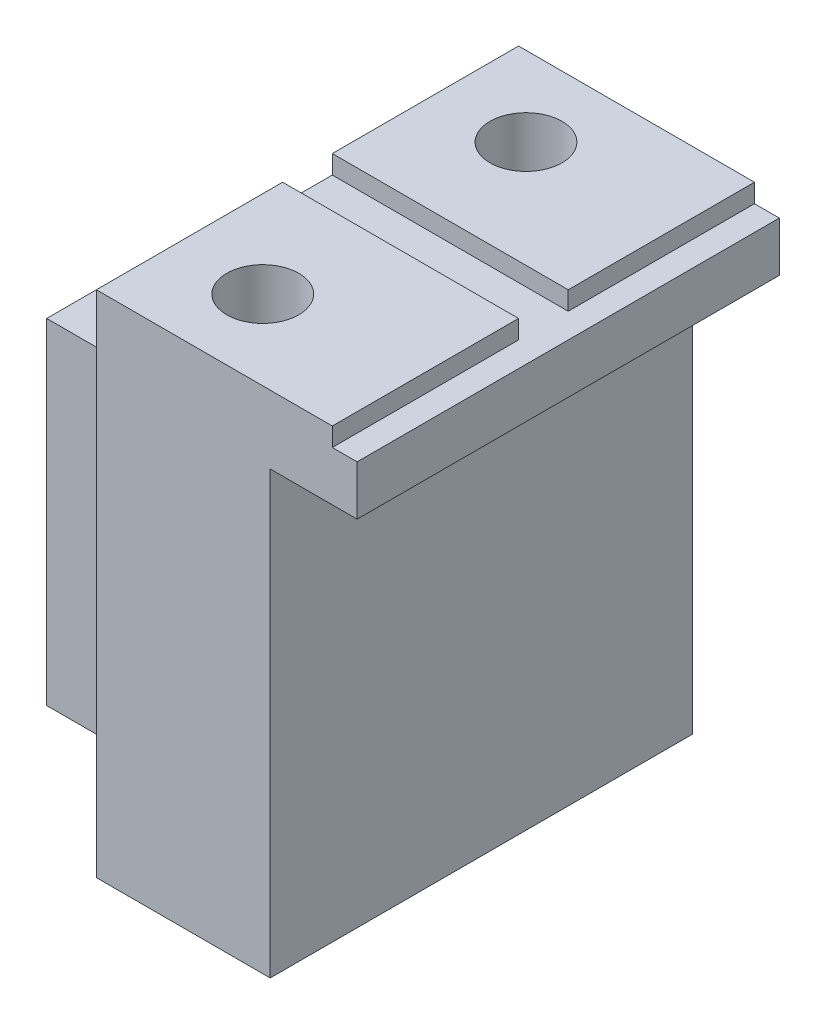
ISO-10303-21;
HEADER;
FILE_DESCRIPTION(('STEP AP214'),'2;1');
FILE_NAME('part.step','',(''),(''),'','','');
FILE_SCHEMA(('AUTOMOTIVE_DESIGN { 1 0 10303 214 1 1 1 1 }'));
ENDSEC;
DATA;
#1=APPLICATION_CONTEXT('core data for automotive mechanical design processes');
#2=APPLICATION_PROTOCOL_DEFINITION('international standard','automotive_design',2000,#1);
#3=PRODUCT_CONTEXT('',#1,'mechanical');
#4=PRODUCT('Part','Part','',(#3));
#5=PRODUCT_RELATED_PRODUCT_CATEGORY('part','',(#4));
#6=PRODUCT_DEFINITION_FORMATION('','',#4);
#7=PRODUCT_DEFINITION_CONTEXT('part definition',#1,'design');
#8=PRODUCT_DEFINITION('design','',#6,#7);
#9=PRODUCT_DEFINITION_SHAPE('','',#8);
#10=(LENGTH_UNIT() NAMED_UNIT(*) SI_UNIT(.MILLI.,.METRE.));
#11=(NAMED_UNIT(*) PLANE_ANGLE_UNIT() SI_UNIT($,.RADIAN.));
#12=(NAMED_UNIT(*) SI_UNIT($,.STERADIAN.) SOLID_ANGLE_UNIT());
#13=UNCERTAINTY_MEASURE_WITH_UNIT(LENGTH_MEASURE(1.E-05),#10,'distance_accuracy_value','');
#14=(GEOMETRIC_REPRESENTATION_CONTEXT(3) GLOBAL_UNCERTAINTY_ASSIGNED_CONTEXT((#13)) GLOBAL_UNIT_ASSIGNED_CONTEXT((#10,
#11,#12)) REPRESENTATION_CONTEXT('',''));
#15=CARTESIAN_POINT('',(0.,0.,0.));
#16=DIRECTION('',(0.,0.,1.));
#17=DIRECTION('',(1.,0.,0.));
#18=AXIS2_PLACEMENT_3D('',#15,#16,#17);
#19=CARTESIAN_POINT('',(9.5,15.75,7.));
#20=DIRECTION('',(-1.,0.,0.));
#21=DIRECTION('',(0.,0.,1.));
#22=AXIS2_PLACEMENT_3D('',#19,#20,#21);
#23=PLANE('',#22);
#24=DIRECTION('',(0.,0.,-1.));
#25=VECTOR('',#24,1.);
#26=CARTESIAN_POINT('',(9.5,15.75,7.));
#27=LINE('',#26,#25);
#28=CARTESIAN_POINT('',(9.5,15.75,12.));
#29=VERTEX_POINT('',#28);
#30=CARTESIAN_POINT('',(9.5,15.75,4.5));
#31=VERTEX_POINT('',#30);
#32=EDGE_CURVE('E287',#29,#31,#27,.T.);
#33=ORIENTED_EDGE('',*,*,#32,.T.);
#34=DIRECTION('',(0.,-1.,0.));
#35=VECTOR('',#34,1.);
#36=CARTESIAN_POINT('',(9.5,15.75,4.5));
#37=LINE('',#36,#35);
#38=CARTESIAN_POINT('',(9.5,16.5,4.5));
#39=VERTEX_POINT('',#38);
#40=EDGE_CURVE('E198',#39,#31,#37,.T.);
#41=ORIENTED_EDGE('',*,*,#40,.F.);
#42=DIRECTION('',(0.,0.,-1.));
#43=VECTOR('',#42,1.);
#44=CARTESIAN_POINT('',(9.5,16.5,7.));
#45=LINE('',#44,#43);
#46=CARTESIAN_POINT('',(9.5,16.5,12.));
#47=VERTEX_POINT('',#46);
#48=EDGE_CURVE('E283',#47,#39,#45,.T.);
#49=ORIENTED_EDGE('',*,*,#48,.F.);
#50=DIRECTION('',(0.,1.,0.));
#51=VECTOR('',#50,1.);
#52=CARTESIAN_POINT('',(9.5,15.75,12.));
#53=LINE('',#52,#51);
#54=EDGE_CURVE('E239',#29,#47,#53,.T.);
#55=ORIENTED_EDGE('',*,*,#54,.F.);
#56=EDGE_LOOP('',(#33,#41,#49,#55));
#57=FACE_BOUND('',#56,.T.);
#58=ADVANCED_FACE('F33',(#57),#23,.F.);
#59=CARTESIAN_POINT('',(7.,16.5,7.));
#60=DIRECTION('',(0.,-1.,0.));
#61=DIRECTION('',(0.,0.,-1.));
#62=AXIS2_PLACEMENT_3D('',#59,#60,#61);
#63=PLANE('',#62);
#64=CARTESIAN_POINT('',(3.5,16.5,8.8));
#65=DIRECTION('',(0.,1.,0.));
#66=DIRECTION('',(0.,0.,-1.));
#67=AXIS2_PLACEMENT_3D('',#64,#65,#66);
#68=CIRCLE('',#67,1.45);
#69=CARTESIAN_POINT('',(3.5,16.5,7.35));
#70=VERTEX_POINT('',#69);
#71=EDGE_CURVE('E206',#70,#70,#68,.T.);
#72=ORIENTED_EDGE('',*,*,#71,.F.);
#73=EDGE_LOOP('',(#72));
#74=FACE_BOUND('',#73,.T.);
#75=ORIENTED_EDGE('',*,*,#48,.T.);
#76=DIRECTION('',(1.,0.,0.));
#77=VECTOR('',#76,1.);
#78=CARTESIAN_POINT('',(-0.499999999999999,16.5,4.5));
#79=LINE('',#78,#77);
#80=CARTESIAN_POINT('',(0.,16.5,4.5));
#81=VERTEX_POINT('',#80);
#82=EDGE_CURVE('E204',#81,#39,#79,.T.);
#83=ORIENTED_EDGE('',*,*,#82,.F.);
#84=DIRECTION('',(0.,0.,-1.));
#85=VECTOR('',#84,1.);
#86=CARTESIAN_POINT('',(0.,16.5,7.));
#87=LINE('',#86,#85);
#88=CARTESIAN_POINT('',(0.,16.5,12.));
#89=VERTEX_POINT('',#88);
#90=EDGE_CURVE('E281',#89,#81,#87,.T.);
#91=ORIENTED_EDGE('',*,*,#90,.F.);
#92=DIRECTION('',(-1.,0.,0.));
#93=VECTOR('',#92,1.);
#94=CARTESIAN_POINT('',(9.5,16.5,12.));
#95=LINE('',#94,#93);
#96=EDGE_CURVE('E214',#47,#89,#95,.T.);
#97=ORIENTED_EDGE('',*,*,#96,.F.);
#98=EDGE_LOOP('',(#75,#83,#91,#97));
#99=FACE_BOUND('',#98,.T.);
#100=ADVANCED_FACE('F348',(#74,#99),#63,.F.);
#101=CARTESIAN_POINT('',(-3.5,-4.40000000000001,3.5));
#102=DIRECTION('',(0.,1.,0.));
#103=DIRECTION('',(-1.,0.,0.));
#104=AXIS2_PLACEMENT_3D('',#101,#102,#103);
#105=CYLINDRICAL_SURFACE('',#104,1.6);
#106=CARTESIAN_POINT('',(-3.5,6.5,3.5));
#107=DIRECTION('',(0.,1.,0.));
#108=DIRECTION('',(-1.,0.,0.));
#109=AXIS2_PLACEMENT_3D('',#106,#107,#108);
#110=CIRCLE('',#109,1.6);
#111=CARTESIAN_POINT('',(-5.1,6.5,3.5));
#112=VERTEX_POINT('',#111);
#113=EDGE_CURVE('E266',#112,#112,#110,.F.);
#114=ORIENTED_EDGE('',*,*,#113,.F.);
#115=EDGE_LOOP('',(#114));
#116=FACE_BOUND('',#115,.T.);
#117=CARTESIAN_POINT('',(-3.5,-4.,3.5));
#118=DIRECTION('',(0.,1.,0.));
#119=DIRECTION('',(0.,0.,1.));
#120=AXIS2_PLACEMENT_3D('',#117,#118,#119);
#121=CIRCLE('',#120,1.6);
#122=CARTESIAN_POINT('',(-3.5,-4.,5.1));
#123=VERTEX_POINT('',#122);
#124=EDGE_CURVE('E195',#123,#123,#121,.T.);
#125=ORIENTED_EDGE('',*,*,#124,.F.);
#126=EDGE_LOOP('',(#125));
#127=FACE_BOUND('',#126,.T.);
#128=ADVANCED_FACE('F354',(#116,#127),#105,.F.);
#129=CARTESIAN_POINT('',(7.,-4.,7.));
#130=DIRECTION('',(0.,1.,0.));
#131=DIRECTION('',(0.,0.,1.));
#132=AXIS2_PLACEMENT_3D('',#129,#130,#131);
#133=PLANE('',#132);
#134=DIRECTION('',(-1.,0.,0.));
#135=VECTOR('',#134,1.);
#136=CARTESIAN_POINT('',(0.,-4.,-5.));
#137=LINE('',#136,#135);
#138=CARTESIAN_POINT('',(7.,-4.,-5.));
#139=VERTEX_POINT('',#138);
#140=CARTESIAN_POINT('',(0.,-4.,-5.));
#141=VERTEX_POINT('',#140);
#142=EDGE_CURVE('E181',#139,#141,#137,.T.);
#143=ORIENTED_EDGE('',*,*,#142,.F.);
#144=DIRECTION('',(0.,0.,-1.));
#145=VECTOR('',#144,1.);
#146=CARTESIAN_POINT('',(7.,-4.,7.));
#147=LINE('',#146,#145);
#148=CARTESIAN_POINT('',(7.,-4.,12.));
#149=VERTEX_POINT('',#148);
#150=EDGE_CURVE('E164',#149,#139,#147,.T.);
#151=ORIENTED_EDGE('',*,*,#150,.F.);
#152=DIRECTION('',(1.,0.,0.));
#153=VECTOR('',#152,1.);
#154=CARTESIAN_POINT('',(7.,-4.,12.));
#155=LINE('',#154,#153);
#156=CARTESIAN_POINT('',(0.,-4.,12.));
#157=VERTEX_POINT('',#156);
#158=EDGE_CURVE('E183',#157,#149,#155,.T.);
#159=ORIENTED_EDGE('',*,*,#158,.F.);
#160=DIRECTION('',(0.,0.,1.));
#161=VECTOR('',#160,1.);
#162=CARTESIAN_POINT('',(0.,-4.,12.));
#163=LINE('',#162,#161);
#164=CARTESIAN_POINT('',(0.,-4.,7.));
#165=VERTEX_POINT('',#164);
#166=EDGE_CURVE('E189',#165,#157,#163,.T.);
#167=ORIENTED_EDGE('',*,*,#166,.F.);
#168=DIRECTION('',(1.,0.,0.));
#169=VECTOR('',#168,1.);
#170=CARTESIAN_POINT('',(0.,-4.,7.));
#171=LINE('',#170,#169);
#172=CARTESIAN_POINT('',(-7.,-4.,7.));
#173=VERTEX_POINT('',#172);
#174=EDGE_CURVE('E192',#173,#165,#171,.T.);
#175=ORIENTED_EDGE('',*,*,#174,.F.);
#176=DIRECTION('',(0.,0.,1.));
#177=VECTOR('',#176,1.);
#178=CARTESIAN_POINT('',(-7.,-4.,7.));
#179=LINE('',#178,#177);
#180=CARTESIAN_POINT('',(-7.,-4.,0.));
#181=VERTEX_POINT('',#180);
#182=EDGE_CURVE('E175',#181,#173,#179,.T.);
#183=ORIENTED_EDGE('',*,*,#182,.F.);
#184=DIRECTION('',(-1.,0.,0.));
#185=VECTOR('',#184,1.);
#186=CARTESIAN_POINT('',(-7.,-4.,0.));
#187=LINE('',#186,#185);
#188=CARTESIAN_POINT('',(0.,-4.,0.));
#189=VERTEX_POINT('',#188);
#190=EDGE_CURVE('E161',#189,#181,#187,.T.);
#191=ORIENTED_EDGE('',*,*,#190,.F.);
#192=DIRECTION('',(0.,0.,1.));
#193=VECTOR('',#192,1.);
#194=CARTESIAN_POINT('',(0.,-4.,0.));
#195=LINE('',#194,#193);
#196=EDGE_CURVE('E171',#141,#189,#195,.T.);
#197=ORIENTED_EDGE('',*,*,#196,.F.);
#198=EDGE_LOOP('',(#143,#151,#159,#167,#175,#183,#191,#197));
#199=FACE_BOUND('',#198,.T.);
#200=ORIENTED_EDGE('',*,*,#124,.T.);
#201=EDGE_LOOP('',(#200));
#202=FACE_BOUND('',#201,.T.);
#203=ADVANCED_FACE('F35',(#199,#202),#133,.F.);
#204=CARTESIAN_POINT('',(7.,0.,7.));
#205=DIRECTION('',(-1.,0.,0.));
#206=DIRECTION('',(0.,0.,1.));
#207=AXIS2_PLACEMENT_3D('',#204,#205,#206);
#208=PLANE('',#207);
#209=DIRECTION('',(0.,1.,0.));
#210=VECTOR('',#209,1.);
#211=CARTESIAN_POINT('',(7.,13.75,12.));
#212=LINE('',#211,#210);
#213=CARTESIAN_POINT('',(7.,13.75,12.));
#214=VERTEX_POINT('',#213);
#215=EDGE_CURVE('E227',#149,#214,#212,.T.);
#216=ORIENTED_EDGE('',*,*,#215,.F.);
#217=ORIENTED_EDGE('',*,*,#150,.T.);
#218=DIRECTION('',(0.,1.,0.));
#219=VECTOR('',#218,1.);
#220=CARTESIAN_POINT('',(7.,13.75,-5.));
#221=LINE('',#220,#219);
#222=CARTESIAN_POINT('',(7.,13.75,-5.));
#223=VERTEX_POINT('',#222);
#224=EDGE_CURVE('E245',#139,#223,#221,.T.);
#225=ORIENTED_EDGE('',*,*,#224,.T.);
#226=DIRECTION('',(0.,0.,-1.));
#227=VECTOR('',#226,1.);
#228=CARTESIAN_POINT('',(7.,13.75,7.));
#229=LINE('',#228,#227);
#230=EDGE_CURVE('E294',#214,#223,#229,.T.);
#231=ORIENTED_EDGE('',*,*,#230,.F.);
#232=EDGE_LOOP('',(#216,#217,#225,#231));
#233=FACE_BOUND('',#232,.T.);
#234=ADVANCED_FACE('F326',(#233),#208,.F.);
#235=CARTESIAN_POINT('',(7.,13.75,7.));
#236=DIRECTION('',(0.,1.,0.));
#237=DIRECTION('',(0.,0.,1.));
#238=AXIS2_PLACEMENT_3D('',#235,#236,#237);
#239=PLANE('',#238);
#240=ORIENTED_EDGE('',*,*,#230,.T.);
#241=DIRECTION('',(1.,0.,0.));
#242=VECTOR('',#241,1.);
#243=CARTESIAN_POINT('',(7.,13.75,-5.));
#244=LINE('',#243,#242);
#245=CARTESIAN_POINT('',(10.5,13.75,-5.));
#246=VERTEX_POINT('',#245);
#247=EDGE_CURVE('E248',#223,#246,#244,.T.);
#248=ORIENTED_EDGE('',*,*,#247,.T.);
#249=DIRECTION('',(0.,0.,-1.));
#250=VECTOR('',#249,1.);
#251=CARTESIAN_POINT('',(10.5,13.75,7.));
#252=LINE('',#251,#250);
#253=CARTESIAN_POINT('',(10.5,13.75,12.));
#254=VERTEX_POINT('',#253);
#255=EDGE_CURVE('E292',#254,#246,#252,.T.);
#256=ORIENTED_EDGE('',*,*,#255,.F.);
#257=DIRECTION('',(1.,0.,0.));
#258=VECTOR('',#257,1.);
#259=CARTESIAN_POINT('',(7.,13.75,12.));
#260=LINE('',#259,#258);
#261=EDGE_CURVE('E230',#214,#254,#260,.T.);
#262=ORIENTED_EDGE('',*,*,#261,.F.);
#263=EDGE_LOOP('',(#240,#248,#256,#262));
#264=FACE_BOUND('',#263,.T.);
#265=ADVANCED_FACE('F320',(#264),#239,.F.);
#266=CARTESIAN_POINT('',(10.5,15.75,7.));
#267=DIRECTION('',(-1.,0.,0.));
#268=DIRECTION('',(0.,0.,1.));
#269=AXIS2_PLACEMENT_3D('',#266,#267,#268);
#270=PLANE('',#269);
#271=ORIENTED_EDGE('',*,*,#255,.T.);
#272=DIRECTION('',(0.,1.,0.));
#273=VECTOR('',#272,1.);
#274=CARTESIAN_POINT('',(10.5,13.75,-5.));
#275=LINE('',#274,#273);
#276=CARTESIAN_POINT('',(10.5,15.75,-5.));
#277=VERTEX_POINT('',#276);
#278=EDGE_CURVE('E251',#246,#277,#275,.T.);
#279=ORIENTED_EDGE('',*,*,#278,.T.);
#280=DIRECTION('',(0.,0.,-1.));
#281=VECTOR('',#280,1.);
#282=CARTESIAN_POINT('',(10.5,15.75,7.));
#283=LINE('',#282,#281);
#284=CARTESIAN_POINT('',(10.5,15.75,12.));
#285=VERTEX_POINT('',#284);
#286=EDGE_CURVE('E290',#285,#277,#283,.T.);
#287=ORIENTED_EDGE('',*,*,#286,.F.);
#288=DIRECTION('',(0.,1.,0.));
#289=VECTOR('',#288,1.);
#290=CARTESIAN_POINT('',(10.5,13.75,12.));
#291=LINE('',#290,#289);
#292=EDGE_CURVE('E233',#254,#285,#291,.T.);
#293=ORIENTED_EDGE('',*,*,#292,.F.);
#294=EDGE_LOOP('',(#271,#279,#287,#293));
#295=FACE_BOUND('',#294,.T.);
#296=ADVANCED_FACE('F316',(#295),#270,.F.);
#297=CARTESIAN_POINT('',(9.5,15.75,7.));
#298=DIRECTION('',(0.,-1.,0.));
#299=DIRECTION('',(0.,0.,-1.));
#300=AXIS2_PLACEMENT_3D('',#297,#298,#299);
#301=PLANE('',#300);
#302=ORIENTED_EDGE('',*,*,#286,.T.);
#303=DIRECTION('',(-1.,0.,0.));
#304=VECTOR('',#303,1.);
#305=CARTESIAN_POINT('',(10.5,15.75,-5.));
#306=LINE('',#305,#304);
#307=CARTESIAN_POINT('',(9.5,15.75,-5.));
#308=VERTEX_POINT('',#307);
#309=EDGE_CURVE('E254',#277,#308,#306,.T.);
#310=ORIENTED_EDGE('',*,*,#309,.T.);
#311=CARTESIAN_POINT('',(9.5,15.75,2.5));
#312=VERTEX_POINT('',#311);
#313=EDGE_CURVE('E286',#312,#308,#27,.T.);
#314=ORIENTED_EDGE('',*,*,#313,.F.);
#315=DIRECTION('',(1.,0.,0.));
#316=VECTOR('',#315,1.);
#317=CARTESIAN_POINT('',(-0.499999999999999,15.75,2.5));
#318=LINE('',#317,#316);
#319=CARTESIAN_POINT('',(0.,15.75,2.5));
#320=VERTEX_POINT('',#319);
#321=EDGE_CURVE('E48',#320,#312,#318,.T.);
#322=ORIENTED_EDGE('',*,*,#321,.F.);
#323=DIRECTION('',(0.,0.,-1.));
#324=VECTOR('',#323,1.);
#325=CARTESIAN_POINT('',(0.,15.75,7.));
#326=LINE('',#325,#324);
#327=CARTESIAN_POINT('',(0.,15.75,4.5));
#328=VERTEX_POINT('',#327);
#329=EDGE_CURVE('E163',#328,#320,#326,.T.);
#330=ORIENTED_EDGE('',*,*,#329,.F.);
#331=DIRECTION('',(1.,0.,0.));
#332=VECTOR('',#331,1.);
#333=CARTESIAN_POINT('',(-0.499999999999999,15.75,4.5));
#334=LINE('',#333,#332);
#335=EDGE_CURVE('E203',#328,#31,#334,.T.);
#336=ORIENTED_EDGE('',*,*,#335,.T.);
#337=ORIENTED_EDGE('',*,*,#32,.F.);
#338=DIRECTION('',(-1.,0.,0.));
#339=VECTOR('',#338,1.);
#340=CARTESIAN_POINT('',(10.5,15.75,12.));
#341=LINE('',#340,#339);
#342=EDGE_CURVE('E236',#285,#29,#341,.T.);
#343=ORIENTED_EDGE('',*,*,#342,.F.);
#344=EDGE_LOOP('',(#302,#310,#314,#322,#330,#336,#337,#343));
#345=FACE_BOUND('',#344,.T.);
#346=ADVANCED_FACE('F311',(#345),#301,.F.);
#347=CARTESIAN_POINT('',(9.5,16.5,2.5));
#348=VERTEX_POINT('',#347);
#349=CARTESIAN_POINT('',(9.5,16.5,-5.));
#350=VERTEX_POINT('',#349);
#351=EDGE_CURVE('E80',#348,#350,#45,.T.);
#352=ORIENTED_EDGE('',*,*,#351,.F.);
#353=DIRECTION('',(0.,1.,0.));
#354=VECTOR('',#353,1.);
#355=CARTESIAN_POINT('',(9.5,15.75,2.5));
#356=LINE('',#355,#354);
#357=EDGE_CURVE('E201',#312,#348,#356,.T.);
#358=ORIENTED_EDGE('',*,*,#357,.F.);
#359=ORIENTED_EDGE('',*,*,#313,.T.);
#360=DIRECTION('',(0.,1.,0.));
#361=VECTOR('',#360,1.);
#362=CARTESIAN_POINT('',(9.5,15.75,-5.));
#363=LINE('',#362,#361);
#364=EDGE_CURVE('E257',#308,#350,#363,.T.);
#365=ORIENTED_EDGE('',*,*,#364,.T.);
#366=EDGE_LOOP('',(#352,#358,#359,#365));
#367=FACE_BOUND('',#366,.T.);
#368=ADVANCED_FACE('F309',(#367),#23,.F.);
#369=CARTESIAN_POINT('',(3.5,16.5,-1.8));
#370=DIRECTION('',(0.,1.,0.));
#371=DIRECTION('',(0.,0.,1.));
#372=AXIS2_PLACEMENT_3D('',#369,#370,#371);
#373=CIRCLE('',#372,1.45);
#374=CARTESIAN_POINT('',(3.5,16.5,-0.35));
#375=VERTEX_POINT('',#374);
#376=EDGE_CURVE('E215',#375,#375,#373,.T.);
#377=ORIENTED_EDGE('',*,*,#376,.F.);
#378=EDGE_LOOP('',(#377));
#379=FACE_BOUND('',#378,.T.);
#380=CARTESIAN_POINT('',(0.,16.5,2.5));
#381=VERTEX_POINT('',#380);
#382=CARTESIAN_POINT('',(0.,16.5,-5.));
#383=VERTEX_POINT('',#382);
#384=EDGE_CURVE('E280',#381,#383,#87,.T.);
#385=ORIENTED_EDGE('',*,*,#384,.F.);
#386=DIRECTION('',(1.,0.,0.));
#387=VECTOR('',#386,1.);
#388=CARTESIAN_POINT('',(-0.499999999999999,16.5,2.5));
#389=LINE('',#388,#387);
#390=EDGE_CURVE('E207',#381,#348,#389,.T.);
#391=ORIENTED_EDGE('',*,*,#390,.T.);
#392=ORIENTED_EDGE('',*,*,#351,.T.);
#393=DIRECTION('',(-1.,0.,0.));
#394=VECTOR('',#393,1.);
#395=CARTESIAN_POINT('',(9.5,16.5,-5.));
#396=LINE('',#395,#394);
#397=EDGE_CURVE('E242',#350,#383,#396,.T.);
#398=ORIENTED_EDGE('',*,*,#397,.T.);
#399=EDGE_LOOP('',(#385,#391,#392,#398));
#400=FACE_BOUND('',#399,.T.);
#401=ADVANCED_FACE('F303',(#379,#400),#63,.F.);
#402=CARTESIAN_POINT('',(0.,9.5,7.));
#403=DIRECTION('',(1.,0.,0.));
#404=DIRECTION('',(0.,0.,-1.));
#405=AXIS2_PLACEMENT_3D('',#402,#403,#404);
#406=PLANE('',#405);
#407=ORIENTED_EDGE('',*,*,#90,.T.);
#408=DIRECTION('',(0.,-1.,0.));
#409=VECTOR('',#408,1.);
#410=CARTESIAN_POINT('',(0.,9.5,4.5));
#411=LINE('',#410,#409);
#412=EDGE_CURVE('E11',#81,#328,#411,.T.);
#413=ORIENTED_EDGE('',*,*,#412,.T.);
#414=ORIENTED_EDGE('',*,*,#329,.T.);
#415=DIRECTION('',(0.,1.,0.));
#416=VECTOR('',#415,1.);
#417=CARTESIAN_POINT('',(0.,9.5,2.5));
#418=LINE('',#417,#416);
#419=EDGE_CURVE('E41',#320,#381,#418,.T.);
#420=ORIENTED_EDGE('',*,*,#419,.T.);
#421=ORIENTED_EDGE('',*,*,#384,.T.);
#422=DIRECTION('',(0.,-1.,0.));
#423=VECTOR('',#422,1.);
#424=CARTESIAN_POINT('',(0.,16.5,-5.));
#425=LINE('',#424,#423);
#426=EDGE_CURVE('E180',#383,#141,#425,.T.);
#427=ORIENTED_EDGE('',*,*,#426,.T.);
#428=ORIENTED_EDGE('',*,*,#196,.T.);
#429=DIRECTION('',(0.,1.,0.));
#430=VECTOR('',#429,1.);
#431=CARTESIAN_POINT('',(0.,0.,0.));
#432=LINE('',#431,#430);
#433=CARTESIAN_POINT('',(0.,9.5,0.));
#434=VERTEX_POINT('',#433);
#435=EDGE_CURVE('E70',#189,#434,#432,.T.);
#436=ORIENTED_EDGE('',*,*,#435,.T.);
#437=DIRECTION('',(0.,0.,-1.));
#438=VECTOR('',#437,1.);
#439=CARTESIAN_POINT('',(0.,9.5,7.));
#440=LINE('',#439,#438);
#441=CARTESIAN_POINT('',(0.,9.5,7.));
#442=VERTEX_POINT('',#441);
#443=EDGE_CURVE('E278',#442,#434,#440,.T.);
#444=ORIENTED_EDGE('',*,*,#443,.F.);
#445=DIRECTION('',(0.,1.,0.));
#446=VECTOR('',#445,1.);
#447=CARTESIAN_POINT('',(0.,0.,7.));
#448=LINE('',#447,#446);
#449=EDGE_CURVE('E260',#165,#442,#448,.T.);
#450=ORIENTED_EDGE('',*,*,#449,.F.);
#451=ORIENTED_EDGE('',*,*,#166,.T.);
#452=DIRECTION('',(0.,-1.,0.));
#453=VECTOR('',#452,1.);
#454=CARTESIAN_POINT('',(0.,16.5,12.));
#455=LINE('',#454,#453);
#456=EDGE_CURVE('E225',#89,#157,#455,.T.);
#457=ORIENTED_EDGE('',*,*,#456,.F.);
#458=EDGE_LOOP('',(#407,#413,#414,#420,#421,#427,#428,#436,#444,#450,#451,#457));
#459=FACE_BOUND('',#458,.T.);
#460=ADVANCED_FACE('F178',(#459),#406,.F.);
#461=CARTESIAN_POINT('',(0.,9.5,7.));
#462=DIRECTION('',(0.,-1.,0.));
#463=DIRECTION('',(0.,0.,-1.));
#464=AXIS2_PLACEMENT_3D('',#461,#462,#463);
#465=PLANE('',#464);
#466=CARTESIAN_POINT('',(-3.5,9.5,3.5));
#467=DIRECTION('',(0.,1.,0.));
#468=DIRECTION('',(-1.,0.,0.));
#469=AXIS2_PLACEMENT_3D('',#466,#467,#468);
#470=CIRCLE('',#469,2.75);
#471=CARTESIAN_POINT('',(-6.25,9.5,3.5));
#472=VERTEX_POINT('',#471);
#473=EDGE_CURVE('E262',#472,#472,#470,.T.);
#474=ORIENTED_EDGE('',*,*,#473,.F.);
#475=EDGE_LOOP('',(#474));
#476=FACE_BOUND('',#475,.T.);
#477=DIRECTION('',(-1.,0.,0.));
#478=VECTOR('',#477,1.);
#479=CARTESIAN_POINT('',(0.,9.5,0.));
#480=LINE('',#479,#478);
#481=CARTESIAN_POINT('',(-7.,9.5,0.));
#482=VERTEX_POINT('',#481);
#483=EDGE_CURVE('E162',#434,#482,#480,.T.);
#484=ORIENTED_EDGE('',*,*,#483,.T.);
#485=DIRECTION('',(0.,0.,-1.));
#486=VECTOR('',#485,1.);
#487=CARTESIAN_POINT('',(-7.,9.5,7.));
#488=LINE('',#487,#486);
#489=CARTESIAN_POINT('',(-7.,9.5,7.));
#490=VERTEX_POINT('',#489);
#491=EDGE_CURVE('E273',#490,#482,#488,.T.);
#492=ORIENTED_EDGE('',*,*,#491,.F.);
#493=DIRECTION('',(-1.,0.,0.));
#494=VECTOR('',#493,1.);
#495=CARTESIAN_POINT('',(0.,9.5,7.));
#496=LINE('',#495,#494);
#497=EDGE_CURVE('E57',#442,#490,#496,.T.);
#498=ORIENTED_EDGE('',*,*,#497,.F.);
#499=ORIENTED_EDGE('',*,*,#443,.T.);
#500=EDGE_LOOP('',(#484,#492,#498,#499));
#501=FACE_BOUND('',#500,.T.);
#502=ADVANCED_FACE('F334',(#476,#501),#465,.F.);
#503=CARTESIAN_POINT('',(-7.,0.,7.));
#504=DIRECTION('',(1.,0.,0.));
#505=DIRECTION('',(0.,0.,-1.));
#506=AXIS2_PLACEMENT_3D('',#503,#504,#505);
#507=PLANE('',#506);
#508=DIRECTION('',(0.,-1.,0.));
#509=VECTOR('',#508,1.);
#510=CARTESIAN_POINT('',(-7.,0.,0.));
#511=LINE('',#510,#509);
#512=EDGE_CURVE('E271',#482,#181,#511,.T.);
#513=ORIENTED_EDGE('',*,*,#512,.T.);
#514=ORIENTED_EDGE('',*,*,#182,.T.);
#515=DIRECTION('',(0.,-1.,0.));
#516=VECTOR('',#515,1.);
#517=CARTESIAN_POINT('',(-7.,0.,7.));
#518=LINE('',#517,#516);
#519=EDGE_CURVE('E270',#490,#173,#518,.T.);
#520=ORIENTED_EDGE('',*,*,#519,.F.);
#521=ORIENTED_EDGE('',*,*,#491,.T.);
#522=EDGE_LOOP('',(#513,#514,#520,#521));
#523=FACE_BOUND('',#522,.T.);
#524=ADVANCED_FACE('F333',(#523),#507,.F.);
#525=CARTESIAN_POINT('',(0.,0.,7.));
#526=DIRECTION('',(0.,0.,-1.));
#527=DIRECTION('',(-1.,0.,0.));
#528=AXIS2_PLACEMENT_3D('',#525,#526,#527);
#529=PLANE('',#528);
#530=ORIENTED_EDGE('',*,*,#519,.T.);
#531=ORIENTED_EDGE('',*,*,#174,.T.);
#532=ORIENTED_EDGE('',*,*,#449,.T.);
#533=ORIENTED_EDGE('',*,*,#497,.T.);
#534=EDGE_LOOP('',(#530,#531,#532,#533));
#535=FACE_BOUND('',#534,.T.);
#536=ADVANCED_FACE('F330',(#535),#529,.F.);
#537=CARTESIAN_POINT('',(0.,0.,0.));
#538=DIRECTION('',(0.,0.,-1.));
#539=DIRECTION('',(-1.,0.,0.));
#540=AXIS2_PLACEMENT_3D('',#537,#538,#539);
#541=PLANE('',#540);
#542=ORIENTED_EDGE('',*,*,#435,.F.);
#543=ORIENTED_EDGE('',*,*,#190,.T.);
#544=ORIENTED_EDGE('',*,*,#512,.F.);
#545=ORIENTED_EDGE('',*,*,#483,.F.);
#546=EDGE_LOOP('',(#542,#543,#544,#545));
#547=FACE_BOUND('',#546,.T.);
#548=ADVANCED_FACE('F159',(#547),#541,.T.);
#549=CARTESIAN_POINT('',(-3.5,6.5,3.5));
#550=DIRECTION('',(0.,1.,0.));
#551=DIRECTION('',(-1.,0.,0.));
#552=AXIS2_PLACEMENT_3D('',#549,#550,#551);
#553=PLANE('',#552);
#554=CARTESIAN_POINT('',(-3.5,6.5,3.5));
#555=DIRECTION('',(0.,1.,0.));
#556=DIRECTION('',(-1.,0.,0.));
#557=AXIS2_PLACEMENT_3D('',#554,#555,#556);
#558=CIRCLE('',#557,2.75);
#559=CARTESIAN_POINT('',(-6.25,6.5,3.5));
#560=VERTEX_POINT('',#559);
#561=EDGE_CURVE('E263',#560,#560,#558,.T.);
#562=ORIENTED_EDGE('',*,*,#561,.T.);
#563=EDGE_LOOP('',(#562));
#564=FACE_BOUND('',#563,.T.);
#565=ORIENTED_EDGE('',*,*,#113,.T.);
#566=EDGE_LOOP('',(#565));
#567=FACE_BOUND('',#566,.T.);
#568=ADVANCED_FACE('F390',(#564,#567),#553,.T.);
#569=CARTESIAN_POINT('',(-3.5,6.5,3.5));
#570=DIRECTION('',(0.,1.,0.));
#571=DIRECTION('',(-1.,0.,0.));
#572=AXIS2_PLACEMENT_3D('',#569,#570,#571);
#573=CYLINDRICAL_SURFACE('',#572,2.75);
#574=ORIENTED_EDGE('',*,*,#561,.F.);
#575=EDGE_LOOP('',(#574));
#576=FACE_BOUND('',#575,.T.);
#577=ORIENTED_EDGE('',*,*,#473,.T.);
#578=EDGE_LOOP('',(#577));
#579=FACE_BOUND('',#578,.T.);
#580=ADVANCED_FACE('F385',(#576,#579),#573,.F.);
#581=CARTESIAN_POINT('',(0.,0.,-5.));
#582=DIRECTION('',(0.,0.,1.));
#583=DIRECTION('',(1.,0.,0.));
#584=AXIS2_PLACEMENT_3D('',#581,#582,#583);
#585=PLANE('',#584);
#586=ORIENTED_EDGE('',*,*,#397,.F.);
#587=ORIENTED_EDGE('',*,*,#364,.F.);
#588=ORIENTED_EDGE('',*,*,#309,.F.);
#589=ORIENTED_EDGE('',*,*,#278,.F.);
#590=ORIENTED_EDGE('',*,*,#247,.F.);
#591=ORIENTED_EDGE('',*,*,#224,.F.);
#592=ORIENTED_EDGE('',*,*,#142,.T.);
#593=ORIENTED_EDGE('',*,*,#426,.F.);
#594=EDGE_LOOP('',(#586,#587,#588,#589,#590,#591,#592,#593));
#595=FACE_BOUND('',#594,.T.);
#596=ADVANCED_FACE('F306',(#595),#585,.F.);
#597=CARTESIAN_POINT('',(0.,0.,12.));
#598=DIRECTION('',(0.,0.,1.));
#599=DIRECTION('',(1.,0.,0.));
#600=AXIS2_PLACEMENT_3D('',#597,#598,#599);
#601=PLANE('',#600);
#602=ORIENTED_EDGE('',*,*,#96,.T.);
#603=ORIENTED_EDGE('',*,*,#456,.T.);
#604=ORIENTED_EDGE('',*,*,#158,.T.);
#605=ORIENTED_EDGE('',*,*,#215,.T.);
#606=ORIENTED_EDGE('',*,*,#261,.T.);
#607=ORIENTED_EDGE('',*,*,#292,.T.);
#608=ORIENTED_EDGE('',*,*,#342,.T.);
#609=ORIENTED_EDGE('',*,*,#54,.T.);
#610=EDGE_LOOP('',(#602,#603,#604,#605,#606,#607,#608,#609));
#611=FACE_BOUND('',#610,.T.);
#612=ADVANCED_FACE('F322',(#611),#601,.T.);
#613=CARTESIAN_POINT('',(3.5,6.5,8.8));
#614=DIRECTION('',(0.,1.,0.));
#615=DIRECTION('',(0.,0.,1.));
#616=AXIS2_PLACEMENT_3D('',#613,#614,#615);
#617=CYLINDRICAL_SURFACE('',#616,1.45);
#618=CARTESIAN_POINT('',(3.5,6.5,8.8));
#619=DIRECTION('',(0.,1.,0.));
#620=DIRECTION('',(0.,0.,-1.));
#621=AXIS2_PLACEMENT_3D('',#618,#619,#620);
#622=CIRCLE('',#621,1.45);
#623=CARTESIAN_POINT('',(3.5,6.5,7.35));
#624=VERTEX_POINT('',#623);
#625=EDGE_CURVE('E218',#624,#624,#622,.T.);
#626=ORIENTED_EDGE('',*,*,#625,.F.);
#627=EDGE_LOOP('',(#626));
#628=FACE_BOUND('',#627,.T.);
#629=ORIENTED_EDGE('',*,*,#71,.T.);
#630=EDGE_LOOP('',(#629));
#631=FACE_BOUND('',#630,.T.);
#632=ADVANCED_FACE('F404',(#628,#631),#617,.F.);
#633=CARTESIAN_POINT('',(3.5,6.5,8.8));
#634=DIRECTION('',(0.,-1.,0.));
#635=DIRECTION('',(0.,0.,-1.));
#636=AXIS2_PLACEMENT_3D('',#633,#634,#635);
#637=PLANE('',#636);
#638=ORIENTED_EDGE('',*,*,#625,.T.);
#639=EDGE_LOOP('',(#638));
#640=FACE_BOUND('',#639,.T.);
#641=ADVANCED_FACE('F407',(#640),#637,.F.);
#642=CARTESIAN_POINT('',(3.5,6.5,-1.8));
#643=DIRECTION('',(0.,1.,0.));
#644=DIRECTION('',(0.,0.,1.));
#645=AXIS2_PLACEMENT_3D('',#642,#643,#644);
#646=CYLINDRICAL_SURFACE('',#645,1.45);
#647=CARTESIAN_POINT('',(3.5,6.5,-1.8));
#648=DIRECTION('',(0.,1.,0.));
#649=DIRECTION('',(0.,0.,1.));
#650=AXIS2_PLACEMENT_3D('',#647,#648,#649);
#651=CIRCLE('',#650,1.45);
#652=CARTESIAN_POINT('',(3.5,6.5,-0.35));
#653=VERTEX_POINT('',#652);
#654=EDGE_CURVE('E211',#653,#653,#651,.T.);
#655=ORIENTED_EDGE('',*,*,#654,.F.);
#656=EDGE_LOOP('',(#655));
#657=FACE_BOUND('',#656,.T.);
#658=ORIENTED_EDGE('',*,*,#376,.T.);
#659=EDGE_LOOP('',(#658));
#660=FACE_BOUND('',#659,.T.);
#661=ADVANCED_FACE('F411',(#657,#660),#646,.F.);
#662=CARTESIAN_POINT('',(3.5,6.5,-1.8));
#663=DIRECTION('',(0.,1.,0.));
#664=DIRECTION('',(0.,0.,1.));
#665=AXIS2_PLACEMENT_3D('',#662,#663,#664);
#666=PLANE('',#665);
#667=ORIENTED_EDGE('',*,*,#654,.T.);
#668=EDGE_LOOP('',(#667));
#669=FACE_BOUND('',#668,.T.);
#670=ADVANCED_FACE('F415',(#669),#666,.T.);
#671=CARTESIAN_POINT('',(-0.499999999999999,15.75,4.5));
#672=DIRECTION('',(0.,0.,1.));
#673=DIRECTION('',(1.,0.,0.));
#674=AXIS2_PLACEMENT_3D('',#671,#672,#673);
#675=PLANE('',#674);
#676=ORIENTED_EDGE('',*,*,#82,.T.);
#677=ORIENTED_EDGE('',*,*,#40,.T.);
#678=ORIENTED_EDGE('',*,*,#335,.F.);
#679=ORIENTED_EDGE('',*,*,#412,.F.);
#680=EDGE_LOOP('',(#676,#677,#678,#679));
#681=FACE_BOUND('',#680,.T.);
#682=ADVANCED_FACE('F419',(#681),#675,.F.);
#683=CARTESIAN_POINT('',(-0.499999999999999,15.75,2.5));
#684=DIRECTION('',(0.,0.,-1.));
#685=DIRECTION('',(-1.,0.,0.));
#686=AXIS2_PLACEMENT_3D('',#683,#684,#685);
#687=PLANE('',#686);
#688=ORIENTED_EDGE('',*,*,#321,.T.);
#689=ORIENTED_EDGE('',*,*,#357,.T.);
#690=ORIENTED_EDGE('',*,*,#390,.F.);
#691=ORIENTED_EDGE('',*,*,#419,.F.);
#692=EDGE_LOOP('',(#688,#689,#690,#691));
#693=FACE_BOUND('',#692,.T.);
#694=ADVANCED_FACE('F423',(#693),#687,.F.);
#695=CLOSED_SHELL('',(#58,#100,#128,#203,#234,#265,#296,#346,#368,#401,#460,#502,#524,#536,#548,
#568,#580,#596,#612,#632,#641,#661,#670,#682,#694));
#696=MANIFOLD_SOLID_BREP('B2',#695);
#697=ADVANCED_BREP_SHAPE_REPRESENTATION('',(#18,#696),#14);
#698=SHAPE_DEFINITION_REPRESENTATION(#9,#697);
ENDSEC;
END-ISO-10303-21;
